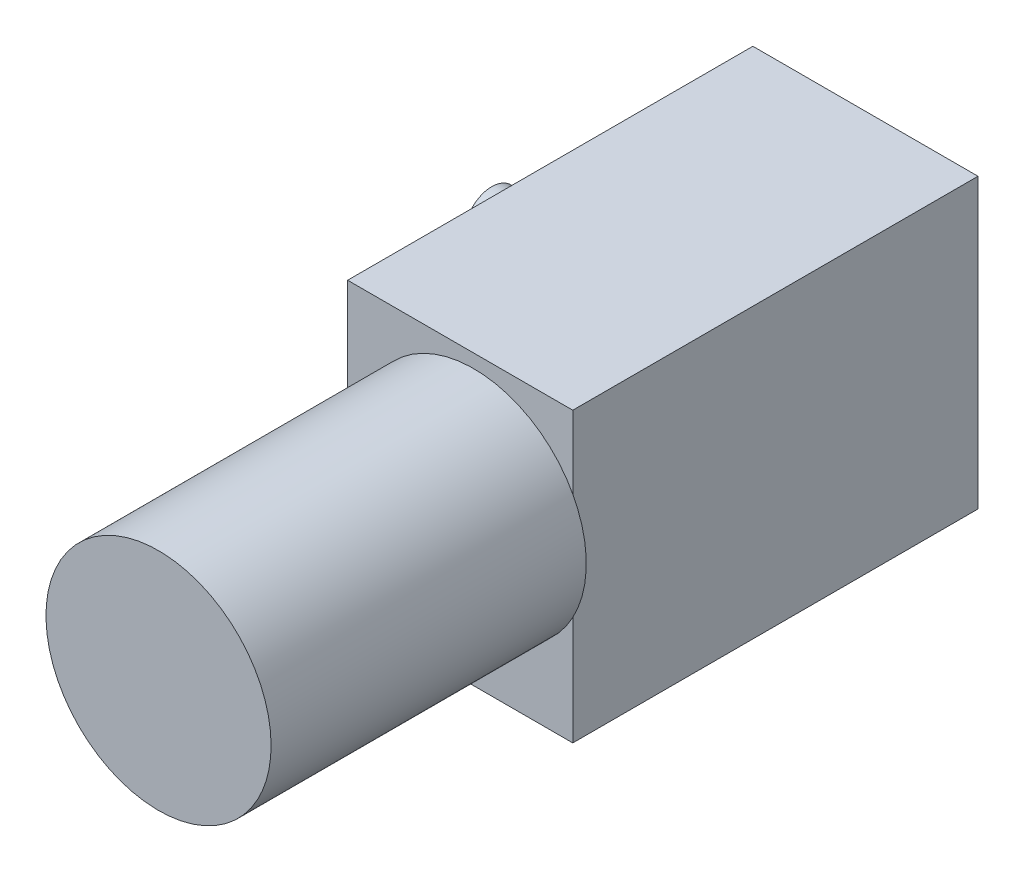
ISO-10303-21;
HEADER;
FILE_DESCRIPTION(('STEP AP214'),'2;1');
FILE_NAME('part.step','',(''),(''),'','','');
FILE_SCHEMA(('AUTOMOTIVE_DESIGN { 1 0 10303 214 1 1 1 1 }'));
ENDSEC;
DATA;
#1=APPLICATION_CONTEXT('core data for automotive mechanical design processes');
#2=APPLICATION_PROTOCOL_DEFINITION('international standard','automotive_design',2000,#1);
#3=PRODUCT_CONTEXT('',#1,'mechanical');
#4=PRODUCT('Part','Part','',(#3));
#5=PRODUCT_RELATED_PRODUCT_CATEGORY('part','',(#4));
#6=PRODUCT_DEFINITION_FORMATION('','',#4);
#7=PRODUCT_DEFINITION_CONTEXT('part definition',#1,'design');
#8=PRODUCT_DEFINITION('design','',#6,#7);
#9=PRODUCT_DEFINITION_SHAPE('','',#8);
#10=(LENGTH_UNIT() NAMED_UNIT(*) SI_UNIT(.MILLI.,.METRE.));
#11=(NAMED_UNIT(*) PLANE_ANGLE_UNIT() SI_UNIT($,.RADIAN.));
#12=(NAMED_UNIT(*) SI_UNIT($,.STERADIAN.) SOLID_ANGLE_UNIT());
#13=UNCERTAINTY_MEASURE_WITH_UNIT(LENGTH_MEASURE(1.E-05),#10,'distance_accuracy_value','');
#14=(GEOMETRIC_REPRESENTATION_CONTEXT(3) GLOBAL_UNCERTAINTY_ASSIGNED_CONTEXT((#13)) GLOBAL_UNIT_ASSIGNED_CONTEXT((#10,
#11,#12)) REPRESENTATION_CONTEXT('',''));
#15=CARTESIAN_POINT('',(0.,0.,0.));
#16=DIRECTION('',(0.,0.,1.));
#17=DIRECTION('',(1.,0.,0.));
#18=AXIS2_PLACEMENT_3D('',#15,#16,#17);
#19=CARTESIAN_POINT('',(0.,-24.7956068827438,28.1771819697131));
#20=DIRECTION('',(1.,0.,0.));
#21=DIRECTION('',(0.,0.,-1.));
#22=AXIS2_PLACEMENT_3D('',#19,#20,#21);
#23=PLANE('',#22);
#24=CARTESIAN_POINT('',(0.,-17.7956068827438,-10.8228180302869));
#25=DIRECTION('',(-1.,0.,0.));
#26=DIRECTION('',(0.,0.,1.));
#27=AXIS2_PLACEMENT_3D('',#24,#25,#26);
#28=CIRCLE('',#27,1.5);
#29=CARTESIAN_POINT('',(0.,-17.7956068827438,-9.32281803028692));
#30=VERTEX_POINT('',#29);
#31=EDGE_CURVE('E209',#30,#30,#28,.T.);
#32=ORIENTED_EDGE('',*,*,#31,.F.);
#33=EDGE_LOOP('',(#32));
#34=FACE_BOUND('',#33,.T.);
#35=CARTESIAN_POINT('',(0.,-17.7956068827438,22.1771819697131));
#36=DIRECTION('',(-1.,0.,0.));
#37=DIRECTION('',(0.,0.,1.));
#38=AXIS2_PLACEMENT_3D('',#35,#36,#37);
#39=CIRCLE('',#38,1.5);
#40=CARTESIAN_POINT('',(0.,-17.7956068827438,23.6771819697131));
#41=VERTEX_POINT('',#40);
#42=EDGE_CURVE('E213',#41,#41,#39,.T.);
#43=ORIENTED_EDGE('',*,*,#42,.F.);
#44=EDGE_LOOP('',(#43));
#45=FACE_BOUND('',#44,.T.);
#46=CARTESIAN_POINT('',(0.,0.204393117256179,22.1771819697131));
#47=DIRECTION('',(-1.,0.,0.));
#48=DIRECTION('',(0.,0.,1.));
#49=AXIS2_PLACEMENT_3D('',#46,#47,#48);
#50=CIRCLE('',#49,1.5);
#51=CARTESIAN_POINT('',(0.,0.204393117256179,23.6771819697131));
#52=VERTEX_POINT('',#51);
#53=EDGE_CURVE('E220',#52,#52,#50,.T.);
#54=ORIENTED_EDGE('',*,*,#53,.F.);
#55=EDGE_LOOP('',(#54));
#56=FACE_BOUND('',#55,.T.);
#57=CARTESIAN_POINT('',(0.,0.204393117256179,-10.8228180302869));
#58=DIRECTION('',(-1.,0.,0.));
#59=DIRECTION('',(0.,0.,1.));
#60=AXIS2_PLACEMENT_3D('',#57,#58,#59);
#61=CIRCLE('',#60,1.5);
#62=CARTESIAN_POINT('',(0.,0.204393117256179,-9.32281803028692));
#63=VERTEX_POINT('',#62);
#64=EDGE_CURVE('E223',#63,#63,#61,.T.);
#65=ORIENTED_EDGE('',*,*,#64,.F.);
#66=EDGE_LOOP('',(#65));
#67=FACE_BOUND('',#66,.T.);
#68=DIRECTION('',(0.,-1.,0.));
#69=VECTOR('',#68,1.);
#70=CARTESIAN_POINT('',(0.,7.20439311725618,28.1771819697131));
#71=LINE('',#70,#69);
#72=CARTESIAN_POINT('',(0.,7.20439311725618,28.1771819697131));
#73=VERTEX_POINT('',#72);
#74=CARTESIAN_POINT('',(0.,-24.7956068827438,28.1771819697131));
#75=VERTEX_POINT('',#74);
#76=EDGE_CURVE('E104',#73,#75,#71,.T.);
#77=ORIENTED_EDGE('',*,*,#76,.F.);
#78=DIRECTION('',(0.,0.,1.));
#79=VECTOR('',#78,1.);
#80=CARTESIAN_POINT('',(0.,7.20439311725618,28.1771819697131));
#81=LINE('',#80,#79);
#82=CARTESIAN_POINT('',(0.,7.20439311725618,-16.8228180302869));
#83=VERTEX_POINT('',#82);
#84=EDGE_CURVE('E76',#83,#73,#81,.T.);
#85=ORIENTED_EDGE('',*,*,#84,.F.);
#86=DIRECTION('',(0.,1.,0.));
#87=VECTOR('',#86,1.);
#88=CARTESIAN_POINT('',(0.,7.20439311725618,-16.8228180302869));
#89=LINE('',#88,#87);
#90=CARTESIAN_POINT('',(0.,-24.7956068827438,-16.8228180302869));
#91=VERTEX_POINT('',#90);
#92=EDGE_CURVE('E117',#91,#83,#89,.T.);
#93=ORIENTED_EDGE('',*,*,#92,.F.);
#94=DIRECTION('',(0.,0.,-1.));
#95=VECTOR('',#94,1.);
#96=CARTESIAN_POINT('',(0.,-24.7956068827438,28.1771819697131));
#97=LINE('',#96,#95);
#98=EDGE_CURVE('E115',#75,#91,#97,.T.);
#99=ORIENTED_EDGE('',*,*,#98,.F.);
#100=EDGE_LOOP('',(#77,#85,#93,#99));
#101=FACE_BOUND('',#100,.T.);
#102=CARTESIAN_POINT('',(0.,-8.79560688274382,-1.82281803028692));
#103=DIRECTION('',(1.,0.,0.));
#104=DIRECTION('',(0.,0.,-1.));
#105=AXIS2_PLACEMENT_3D('',#102,#103,#104);
#106=CIRCLE('',#105,3.);
#107=CARTESIAN_POINT('',(0.,-8.79560688274382,-4.82281803028692));
#108=VERTEX_POINT('',#107);
#109=EDGE_CURVE('E11',#108,#108,#106,.F.);
#110=ORIENTED_EDGE('',*,*,#109,.F.);
#111=EDGE_LOOP('',(#110));
#112=FACE_BOUND('',#111,.T.);
#113=ADVANCED_FACE('F32',(#34,#45,#56,#67,#101,#112),#23,.F.);
#114=CARTESIAN_POINT('',(25.,7.20439311725618,28.1771819697131));
#115=DIRECTION('',(0.,0.,-1.));
#116=DIRECTION('',(-1.,0.,0.));
#117=AXIS2_PLACEMENT_3D('',#114,#115,#116);
#118=PLANE('',#117);
#119=CARTESIAN_POINT('',(14.,-6.79560688274382,28.1771819697131));
#120=DIRECTION('',(0.,0.,1.));
#121=DIRECTION('',(1.,0.,0.));
#122=AXIS2_PLACEMENT_3D('',#119,#120,#121);
#123=CIRCLE('',#122,12.5);
#124=CARTESIAN_POINT('',(25.,-0.858435839224857,28.1771819697131));
#125=VERTEX_POINT('',#124);
#126=CARTESIAN_POINT('',(25.,-12.7327779262628,28.1771819697131));
#127=VERTEX_POINT('',#126);
#128=EDGE_CURVE('E47',#125,#127,#123,.T.);
#129=ORIENTED_EDGE('',*,*,#128,.F.);
#130=DIRECTION('',(0.,-1.,0.));
#131=VECTOR('',#130,1.);
#132=CARTESIAN_POINT('',(25.,7.20439311725618,28.1771819697131));
#133=LINE('',#132,#131);
#134=CARTESIAN_POINT('',(25.,7.20439311725618,28.1771819697131));
#135=VERTEX_POINT('',#134);
#136=EDGE_CURVE('E88',#135,#125,#133,.T.);
#137=ORIENTED_EDGE('',*,*,#136,.F.);
#138=DIRECTION('',(-1.,0.,0.));
#139=VECTOR('',#138,1.);
#140=CARTESIAN_POINT('',(25.,7.20439311725618,28.1771819697131));
#141=LINE('',#140,#139);
#142=EDGE_CURVE('E113',#135,#73,#141,.T.);
#143=ORIENTED_EDGE('',*,*,#142,.T.);
#144=ORIENTED_EDGE('',*,*,#76,.T.);
#145=DIRECTION('',(-1.,0.,0.));
#146=VECTOR('',#145,1.);
#147=CARTESIAN_POINT('',(25.,-24.7956068827438,28.1771819697131));
#148=LINE('',#147,#146);
#149=CARTESIAN_POINT('',(25.,-24.7956068827438,28.1771819697131));
#150=VERTEX_POINT('',#149);
#151=EDGE_CURVE('E40',#150,#75,#148,.T.);
#152=ORIENTED_EDGE('',*,*,#151,.F.);
#153=EDGE_CURVE('E82',#127,#150,#133,.T.);
#154=ORIENTED_EDGE('',*,*,#153,.F.);
#155=EDGE_LOOP('',(#129,#137,#143,#144,#152,#154));
#156=FACE_BOUND('',#155,.T.);
#157=ADVANCED_FACE('F34',(#156),#118,.F.);
#158=CARTESIAN_POINT('',(25.,-24.7956068827438,28.1771819697131));
#159=DIRECTION('',(0.,1.,0.));
#160=DIRECTION('',(0.,0.,1.));
#161=AXIS2_PLACEMENT_3D('',#158,#159,#160);
#162=PLANE('',#161);
#163=ORIENTED_EDGE('',*,*,#98,.T.);
#164=DIRECTION('',(-1.,0.,0.));
#165=VECTOR('',#164,1.);
#166=CARTESIAN_POINT('',(25.,-24.7956068827438,-16.8228180302869));
#167=LINE('',#166,#165);
#168=CARTESIAN_POINT('',(25.,-24.7956068827438,-16.8228180302869));
#169=VERTEX_POINT('',#168);
#170=EDGE_CURVE('E123',#169,#91,#167,.T.);
#171=ORIENTED_EDGE('',*,*,#170,.F.);
#172=DIRECTION('',(0.,0.,-1.));
#173=VECTOR('',#172,1.);
#174=CARTESIAN_POINT('',(25.,-24.7956068827438,28.1771819697131));
#175=LINE('',#174,#173);
#176=EDGE_CURVE('E108',#150,#169,#175,.T.);
#177=ORIENTED_EDGE('',*,*,#176,.F.);
#178=ORIENTED_EDGE('',*,*,#151,.T.);
#179=EDGE_LOOP('',(#163,#171,#177,#178));
#180=FACE_BOUND('',#179,.T.);
#181=ADVANCED_FACE('F126',(#180),#162,.F.);
#182=CARTESIAN_POINT('',(25.,7.20439311725618,-16.8228180302869));
#183=DIRECTION('',(0.,0.,1.));
#184=DIRECTION('',(0.,-1.,0.));
#185=AXIS2_PLACEMENT_3D('',#182,#183,#184);
#186=PLANE('',#185);
#187=ORIENTED_EDGE('',*,*,#92,.T.);
#188=DIRECTION('',(-1.,0.,0.));
#189=VECTOR('',#188,1.);
#190=CARTESIAN_POINT('',(25.,7.20439311725618,-16.8228180302869));
#191=LINE('',#190,#189);
#192=CARTESIAN_POINT('',(25.,7.20439311725618,-16.8228180302869));
#193=VERTEX_POINT('',#192);
#194=EDGE_CURVE('E121',#193,#83,#191,.T.);
#195=ORIENTED_EDGE('',*,*,#194,.F.);
#196=DIRECTION('',(0.,1.,0.));
#197=VECTOR('',#196,1.);
#198=CARTESIAN_POINT('',(25.,7.20439311725618,-16.8228180302869));
#199=LINE('',#198,#197);
#200=EDGE_CURVE('E110',#169,#193,#199,.T.);
#201=ORIENTED_EDGE('',*,*,#200,.F.);
#202=ORIENTED_EDGE('',*,*,#170,.T.);
#203=EDGE_LOOP('',(#187,#195,#201,#202));
#204=FACE_BOUND('',#203,.T.);
#205=ADVANCED_FACE('F134',(#204),#186,.F.);
#206=CARTESIAN_POINT('',(25.,7.20439311725618,28.1771819697131));
#207=DIRECTION('',(0.,-1.,0.));
#208=DIRECTION('',(0.,0.,-1.));
#209=AXIS2_PLACEMENT_3D('',#206,#207,#208);
#210=PLANE('',#209);
#211=ORIENTED_EDGE('',*,*,#84,.T.);
#212=ORIENTED_EDGE('',*,*,#142,.F.);
#213=DIRECTION('',(0.,0.,1.));
#214=VECTOR('',#213,1.);
#215=CARTESIAN_POINT('',(25.,7.20439311725618,28.1771819697131));
#216=LINE('',#215,#214);
#217=EDGE_CURVE('E55',#193,#135,#216,.T.);
#218=ORIENTED_EDGE('',*,*,#217,.F.);
#219=ORIENTED_EDGE('',*,*,#194,.T.);
#220=EDGE_LOOP('',(#211,#212,#218,#219));
#221=FACE_BOUND('',#220,.T.);
#222=ADVANCED_FACE('F136',(#221),#210,.F.);
#223=CARTESIAN_POINT('',(25.,-24.7956068827438,28.1771819697131));
#224=DIRECTION('',(1.,0.,0.));
#225=DIRECTION('',(0.,0.,-1.));
#226=AXIS2_PLACEMENT_3D('',#223,#224,#225);
#227=PLANE('',#226);
#228=ORIENTED_EDGE('',*,*,#136,.T.);
#229=EDGE_CURVE('E86',#125,#127,#133,.T.);
#230=ORIENTED_EDGE('',*,*,#229,.T.);
#231=ORIENTED_EDGE('',*,*,#153,.T.);
#232=ORIENTED_EDGE('',*,*,#176,.T.);
#233=ORIENTED_EDGE('',*,*,#200,.T.);
#234=ORIENTED_EDGE('',*,*,#217,.T.);
#235=EDGE_LOOP('',(#228,#230,#231,#232,#233,#234));
#236=FACE_BOUND('',#235,.T.);
#237=ADVANCED_FACE('F87',(#236),#227,.T.);
#238=CARTESIAN_POINT('',(14.,-6.79560688274382,63.1771819697131));
#239=DIRECTION('',(0.,0.,-1.));
#240=DIRECTION('',(-1.,0.,0.));
#241=AXIS2_PLACEMENT_3D('',#238,#239,#240);
#242=CYLINDRICAL_SURFACE('',#241,12.5);
#243=CARTESIAN_POINT('',(14.,-6.79560688274382,63.1771819697131));
#244=DIRECTION('',(0.,0.,1.));
#245=DIRECTION('',(1.,0.,0.));
#246=AXIS2_PLACEMENT_3D('',#243,#244,#245);
#247=CIRCLE('',#246,12.5);
#248=CARTESIAN_POINT('',(26.5,-6.79560688274382,63.1771819697131));
#249=VERTEX_POINT('',#248);
#250=EDGE_CURVE('E102',#249,#249,#247,.T.);
#251=ORIENTED_EDGE('',*,*,#250,.F.);
#252=EDGE_LOOP('',(#251));
#253=FACE_BOUND('',#252,.T.);
#254=ORIENTED_EDGE('',*,*,#128,.T.);
#255=EDGE_CURVE('E96',#127,#125,#123,.T.);
#256=ORIENTED_EDGE('',*,*,#255,.T.);
#257=EDGE_LOOP('',(#254,#256));
#258=FACE_BOUND('',#257,.T.);
#259=ADVANCED_FACE('F101',(#253,#258),#242,.T.);
#260=CARTESIAN_POINT('',(14.,-6.79560688274382,63.1771819697131));
#261=DIRECTION('',(0.,0.,1.));
#262=DIRECTION('',(1.,0.,0.));
#263=AXIS2_PLACEMENT_3D('',#260,#261,#262);
#264=PLANE('',#263);
#265=ORIENTED_EDGE('',*,*,#250,.T.);
#266=EDGE_LOOP('',(#265));
#267=FACE_BOUND('',#266,.T.);
#268=ADVANCED_FACE('F156',(#267),#264,.T.);
#269=CARTESIAN_POINT('',(14.,-6.79560688274382,28.1771819697131));
#270=DIRECTION('',(0.,0.,1.));
#271=DIRECTION('',(1.,0.,0.));
#272=AXIS2_PLACEMENT_3D('',#269,#270,#271);
#273=PLANE('',#272);
#274=ORIENTED_EDGE('',*,*,#229,.F.);
#275=ORIENTED_EDGE('',*,*,#255,.F.);
#276=EDGE_LOOP('',(#274,#275));
#277=FACE_BOUND('',#276,.T.);
#278=ADVANCED_FACE('F97',(#277),#273,.F.);
#279=CARTESIAN_POINT('',(-14.,-8.79560688274382,-1.82281803028692));
#280=DIRECTION('',(1.,0.,0.));
#281=DIRECTION('',(0.,0.,-1.));
#282=AXIS2_PLACEMENT_3D('',#279,#280,#281);
#283=CYLINDRICAL_SURFACE('',#282,3.);
#284=CARTESIAN_POINT('',(-14.,-8.79560688274382,-1.82281803028692));
#285=DIRECTION('',(-1.,0.,0.));
#286=DIRECTION('',(0.,0.,1.));
#287=AXIS2_PLACEMENT_3D('',#284,#285,#286);
#288=CIRCLE('',#287,3.);
#289=CARTESIAN_POINT('',(-14.,-8.79560688274382,1.17718196971308));
#290=VERTEX_POINT('',#289);
#291=EDGE_CURVE('E99',#290,#290,#288,.T.);
#292=ORIENTED_EDGE('',*,*,#291,.F.);
#293=EDGE_LOOP('',(#292));
#294=FACE_BOUND('',#293,.T.);
#295=ORIENTED_EDGE('',*,*,#109,.T.);
#296=EDGE_LOOP('',(#295));
#297=FACE_BOUND('',#296,.T.);
#298=ADVANCED_FACE('F160',(#294,#297),#283,.T.);
#299=CARTESIAN_POINT('',(-14.,-8.79560688274382,-1.82281803028692));
#300=DIRECTION('',(-1.,0.,0.));
#301=DIRECTION('',(0.,0.,1.));
#302=AXIS2_PLACEMENT_3D('',#299,#300,#301);
#303=PLANE('',#302);
#304=ORIENTED_EDGE('',*,*,#291,.T.);
#305=EDGE_LOOP('',(#304));
#306=FACE_BOUND('',#305,.T.);
#307=ADVANCED_FACE('F166',(#306),#303,.T.);
#308=CARTESIAN_POINT('',(5.,0.204393117256179,-10.8228180302869));
#309=DIRECTION('',(-1.,0.,0.));
#310=DIRECTION('',(0.,0.,1.));
#311=AXIS2_PLACEMENT_3D('',#308,#309,#310);
#312=CYLINDRICAL_SURFACE('',#311,1.5);
#313=CARTESIAN_POINT('',(5.,0.204393117256179,-10.8228180302869));
#314=DIRECTION('',(-1.,0.,0.));
#315=DIRECTION('',(0.,0.,1.));
#316=AXIS2_PLACEMENT_3D('',#313,#314,#315);
#317=CIRCLE('',#316,1.5);
#318=CARTESIAN_POINT('',(5.,0.204393117256179,-9.32281803028692));
#319=VERTEX_POINT('',#318);
#320=EDGE_CURVE('E226',#319,#319,#317,.T.);
#321=ORIENTED_EDGE('',*,*,#320,.F.);
#322=EDGE_LOOP('',(#321));
#323=FACE_BOUND('',#322,.T.);
#324=ORIENTED_EDGE('',*,*,#64,.T.);
#325=EDGE_LOOP('',(#324));
#326=FACE_BOUND('',#325,.T.);
#327=ADVANCED_FACE('F170',(#323,#326),#312,.F.);
#328=CARTESIAN_POINT('',(5.,-51.8863588507613,5.67718196971309));
#329=DIRECTION('',(-1.,0.,0.));
#330=DIRECTION('',(0.,0.,1.));
#331=AXIS2_PLACEMENT_3D('',#328,#329,#330);
#332=PLANE('',#331);
#333=ORIENTED_EDGE('',*,*,#320,.T.);
#334=EDGE_LOOP('',(#333));
#335=FACE_BOUND('',#334,.T.);
#336=ADVANCED_FACE('F174',(#335),#332,.T.);
#337=CARTESIAN_POINT('',(5.,0.204393117256179,22.1771819697131));
#338=DIRECTION('',(-1.,0.,0.));
#339=DIRECTION('',(0.,0.,1.));
#340=AXIS2_PLACEMENT_3D('',#337,#338,#339);
#341=CYLINDRICAL_SURFACE('',#340,1.5);
#342=CARTESIAN_POINT('',(5.,0.204393117256179,22.1771819697131));
#343=DIRECTION('',(-1.,0.,0.));
#344=DIRECTION('',(0.,0.,1.));
#345=AXIS2_PLACEMENT_3D('',#342,#343,#344);
#346=CIRCLE('',#345,1.5);
#347=CARTESIAN_POINT('',(5.,0.204393117256179,23.6771819697131));
#348=VERTEX_POINT('',#347);
#349=EDGE_CURVE('E218',#348,#348,#346,.T.);
#350=ORIENTED_EDGE('',*,*,#349,.F.);
#351=EDGE_LOOP('',(#350));
#352=FACE_BOUND('',#351,.T.);
#353=ORIENTED_EDGE('',*,*,#53,.T.);
#354=EDGE_LOOP('',(#353));
#355=FACE_BOUND('',#354,.T.);
#356=ADVANCED_FACE('F178',(#352,#355),#341,.F.);
#357=CARTESIAN_POINT('',(5.,-51.8863588507613,5.67718196971309));
#358=DIRECTION('',(-1.,0.,0.));
#359=DIRECTION('',(0.,0.,1.));
#360=AXIS2_PLACEMENT_3D('',#357,#358,#359);
#361=PLANE('',#360);
#362=ORIENTED_EDGE('',*,*,#349,.T.);
#363=EDGE_LOOP('',(#362));
#364=FACE_BOUND('',#363,.T.);
#365=ADVANCED_FACE('F180',(#364),#361,.T.);
#366=CARTESIAN_POINT('',(5.,-17.7956068827438,22.1771819697131));
#367=DIRECTION('',(-1.,0.,0.));
#368=DIRECTION('',(0.,0.,1.));
#369=AXIS2_PLACEMENT_3D('',#366,#367,#368);
#370=CYLINDRICAL_SURFACE('',#369,1.5);
#371=CARTESIAN_POINT('',(5.,-17.7956068827438,22.1771819697131));
#372=DIRECTION('',(-1.,0.,0.));
#373=DIRECTION('',(0.,0.,1.));
#374=AXIS2_PLACEMENT_3D('',#371,#372,#373);
#375=CIRCLE('',#374,1.5);
#376=CARTESIAN_POINT('',(5.,-17.7956068827438,23.6771819697131));
#377=VERTEX_POINT('',#376);
#378=EDGE_CURVE('E210',#377,#377,#375,.T.);
#379=ORIENTED_EDGE('',*,*,#378,.F.);
#380=EDGE_LOOP('',(#379));
#381=FACE_BOUND('',#380,.T.);
#382=ORIENTED_EDGE('',*,*,#42,.T.);
#383=EDGE_LOOP('',(#382));
#384=FACE_BOUND('',#383,.T.);
#385=ADVANCED_FACE('F183',(#381,#384),#370,.F.);
#386=CARTESIAN_POINT('',(5.,-51.8863588507613,5.67718196971309));
#387=DIRECTION('',(-1.,0.,0.));
#388=DIRECTION('',(0.,0.,1.));
#389=AXIS2_PLACEMENT_3D('',#386,#387,#388);
#390=PLANE('',#389);
#391=ORIENTED_EDGE('',*,*,#378,.T.);
#392=EDGE_LOOP('',(#391));
#393=FACE_BOUND('',#392,.T.);
#394=ADVANCED_FACE('F188',(#393),#390,.T.);
#395=CARTESIAN_POINT('',(5.,-17.7956068827438,-10.8228180302869));
#396=DIRECTION('',(-1.,0.,0.));
#397=DIRECTION('',(0.,0.,1.));
#398=AXIS2_PLACEMENT_3D('',#395,#396,#397);
#399=CYLINDRICAL_SURFACE('',#398,1.5);
#400=CARTESIAN_POINT('',(5.,-17.7956068827438,-10.8228180302869));
#401=DIRECTION('',(-1.,0.,0.));
#402=DIRECTION('',(0.,0.,1.));
#403=AXIS2_PLACEMENT_3D('',#400,#401,#402);
#404=CIRCLE('',#403,1.5);
#405=CARTESIAN_POINT('',(5.,-17.7956068827438,-9.32281803028692));
#406=VERTEX_POINT('',#405);
#407=EDGE_CURVE('E207',#406,#406,#404,.T.);
#408=ORIENTED_EDGE('',*,*,#407,.F.);
#409=EDGE_LOOP('',(#408));
#410=FACE_BOUND('',#409,.T.);
#411=ORIENTED_EDGE('',*,*,#31,.T.);
#412=EDGE_LOOP('',(#411));
#413=FACE_BOUND('',#412,.T.);
#414=ADVANCED_FACE('F191',(#410,#413),#399,.F.);
#415=CARTESIAN_POINT('',(5.,-17.7956068827438,-10.8228180302869));
#416=DIRECTION('',(-1.,0.,0.));
#417=DIRECTION('',(0.,0.,1.));
#418=AXIS2_PLACEMENT_3D('',#415,#416,#417);
#419=PLANE('',#418);
#420=ORIENTED_EDGE('',*,*,#407,.T.);
#421=EDGE_LOOP('',(#420));
#422=FACE_BOUND('',#421,.T.);
#423=ADVANCED_FACE('F196',(#422),#419,.T.);
#424=CLOSED_SHELL('',(#113,#157,#181,#205,#222,#237,#259,#268,#278,#298,#307,#327,#336,#356,
#365,#385,#394,#414,#423));
#425=MANIFOLD_SOLID_BREP('B2',#424);
#426=ADVANCED_BREP_SHAPE_REPRESENTATION('',(#18,#425),#14);
#427=SHAPE_DEFINITION_REPRESENTATION(#9,#426);
ENDSEC;
END-ISO-10303-21;
